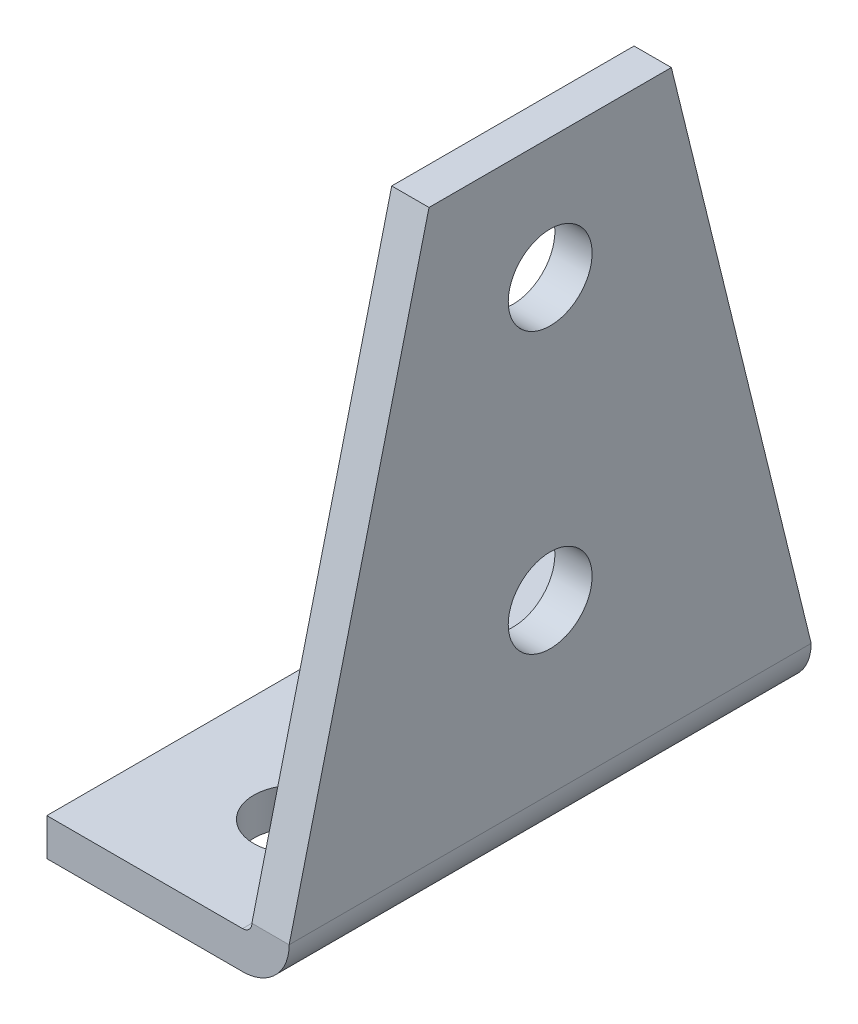
ISO-10303-21;
HEADER;
FILE_DESCRIPTION(('STEP AP214'),'2;1');
FILE_NAME('part.step','',(''),(''),'','','');
FILE_SCHEMA(('AUTOMOTIVE_DESIGN { 1 0 10303 214 1 1 1 1 }'));
ENDSEC;
DATA;
#1=APPLICATION_CONTEXT('core data for automotive mechanical design processes');
#2=APPLICATION_PROTOCOL_DEFINITION('international standard','automotive_design',2000,#1);
#3=PRODUCT_CONTEXT('',#1,'mechanical');
#4=PRODUCT('Part','Part','',(#3));
#5=PRODUCT_RELATED_PRODUCT_CATEGORY('part','',(#4));
#6=PRODUCT_DEFINITION_FORMATION('','',#4);
#7=PRODUCT_DEFINITION_CONTEXT('part definition',#1,'design');
#8=PRODUCT_DEFINITION('design','',#6,#7);
#9=PRODUCT_DEFINITION_SHAPE('','',#8);
#10=(LENGTH_UNIT() NAMED_UNIT(*) SI_UNIT(.MILLI.,.METRE.));
#11=(NAMED_UNIT(*) PLANE_ANGLE_UNIT() SI_UNIT($,.RADIAN.));
#12=(NAMED_UNIT(*) SI_UNIT($,.STERADIAN.) SOLID_ANGLE_UNIT());
#13=UNCERTAINTY_MEASURE_WITH_UNIT(LENGTH_MEASURE(1.E-05),#10,'distance_accuracy_value','');
#14=(GEOMETRIC_REPRESENTATION_CONTEXT(3) GLOBAL_UNCERTAINTY_ASSIGNED_CONTEXT((#13)) GLOBAL_UNIT_ASSIGNED_CONTEXT((#10,
#11,#12)) REPRESENTATION_CONTEXT('',''));
#15=CARTESIAN_POINT('',(0.,0.,0.));
#16=DIRECTION('',(0.,0.,1.));
#17=DIRECTION('',(1.,0.,0.));
#18=AXIS2_PLACEMENT_3D('',#15,#16,#17);
#19=CARTESIAN_POINT('',(4.44089209850063E-13,7.93749999999971,44.4500000000001));
#20=DIRECTION('',(-1.,0.,0.));
#21=DIRECTION('',(0.,0.,1.));
#22=AXIS2_PLACEMENT_3D('',#19,#20,#21);
#23=PLANE('',#22);
#24=CARTESIAN_POINT('',(0.,36.5124999999997,0.));
#25=DIRECTION('',(-1.,0.,0.));
#26=DIRECTION('',(0.,0.,1.));
#27=AXIS2_PLACEMENT_3D('',#24,#25,#26);
#28=CIRCLE('',#27,7.14375);
#29=CARTESIAN_POINT('',(0.,36.5124999999997,7.14375));
#30=VERTEX_POINT('',#29);
#31=EDGE_CURVE('E174',#30,#30,#28,.T.);
#32=ORIENTED_EDGE('',*,*,#31,.T.);
#33=EDGE_LOOP('',(#32));
#34=FACE_BOUND('',#33,.T.);
#35=CARTESIAN_POINT('',(0.,84.1374999999998,0.));
#36=DIRECTION('',(-1.,0.,0.));
#37=DIRECTION('',(0.,0.,1.));
#38=AXIS2_PLACEMENT_3D('',#35,#36,#37);
#39=CIRCLE('',#38,7.14375);
#40=CARTESIAN_POINT('',(0.,84.1374999999998,7.14375));
#41=VERTEX_POINT('',#40);
#42=EDGE_CURVE('E170',#41,#41,#39,.T.);
#43=ORIENTED_EDGE('',*,*,#42,.T.);
#44=EDGE_LOOP('',(#43));
#45=FACE_BOUND('',#44,.T.);
#46=DIRECTION('',(0.,-0.971071693103805,-0.238788121255034));
#47=VECTOR('',#46,1.);
#48=CARTESIAN_POINT('',(4.44089209850063E-13,28.5516662442982,-39.3809427268119));
#49=LINE('',#48,#47);
#50=CARTESIAN_POINT('',(0.,104.775,-20.6375000000001));
#51=VERTEX_POINT('',#50);
#52=CARTESIAN_POINT('',(0.,7.93749999999971,-44.4500000000001));
#53=VERTEX_POINT('',#52);
#54=EDGE_CURVE('E46',#51,#53,#49,.T.);
#55=ORIENTED_EDGE('',*,*,#54,.F.);
#56=DIRECTION('',(0.,0.,-1.));
#57=VECTOR('',#56,1.);
#58=CARTESIAN_POINT('',(0.,104.775,44.4500000000001));
#59=LINE('',#58,#57);
#60=CARTESIAN_POINT('',(0.,104.775,20.6375000000001));
#61=VERTEX_POINT('',#60);
#62=EDGE_CURVE('E129',#61,#51,#59,.T.);
#63=ORIENTED_EDGE('',*,*,#62,.F.);
#64=DIRECTION('',(0.,0.971071693103805,-0.238788121255034));
#65=VECTOR('',#64,1.);
#66=CARTESIAN_POINT('',(4.44089209850063E-13,7.93749999999971,44.4500000000001));
#67=LINE('',#66,#65);
#68=CARTESIAN_POINT('',(4.44089209850063E-13,7.93749999999971,44.4500000000001));
#69=VERTEX_POINT('',#68);
#70=EDGE_CURVE('E109',#69,#61,#67,.T.);
#71=ORIENTED_EDGE('',*,*,#70,.F.);
#72=DIRECTION('',(0.,0.,-1.));
#73=VECTOR('',#72,1.);
#74=CARTESIAN_POINT('',(4.44089209850063E-13,7.93749999999971,44.4500000000001));
#75=LINE('',#74,#73);
#76=EDGE_CURVE('E141',#69,#53,#75,.T.);
#77=ORIENTED_EDGE('',*,*,#76,.T.);
#78=EDGE_LOOP('',(#55,#63,#71,#77));
#79=FACE_BOUND('',#78,.T.);
#80=ADVANCED_FACE('F32',(#34,#45,#79),#23,.F.);
#81=CARTESIAN_POINT('',(-6.34999999999986,104.775,44.4500000000001));
#82=DIRECTION('',(0.,1.,0.));
#83=DIRECTION('',(0.,0.,1.));
#84=AXIS2_PLACEMENT_3D('',#81,#82,#83);
#85=PLANE('',#84);
#86=DIRECTION('',(1.,0.,0.));
#87=VECTOR('',#86,1.);
#88=CARTESIAN_POINT('',(-193.629336002158,104.775000000001,-20.6375000000001));
#89=LINE('',#88,#87);
#90=CARTESIAN_POINT('',(-6.34999999999986,104.775,-20.6375000000001));
#91=VERTEX_POINT('',#90);
#92=EDGE_CURVE('E53',#91,#51,#89,.T.);
#93=ORIENTED_EDGE('',*,*,#92,.F.);
#94=DIRECTION('',(0.,0.,-1.));
#95=VECTOR('',#94,1.);
#96=CARTESIAN_POINT('',(-6.34999999999986,104.775,44.4500000000001));
#97=LINE('',#96,#95);
#98=CARTESIAN_POINT('',(-6.34999999999986,104.775,20.6375000000001));
#99=VERTEX_POINT('',#98);
#100=EDGE_CURVE('E120',#99,#91,#97,.T.);
#101=ORIENTED_EDGE('',*,*,#100,.F.);
#102=DIRECTION('',(1.,0.,0.));
#103=VECTOR('',#102,1.);
#104=CARTESIAN_POINT('',(-193.629336002158,104.775000000001,20.6374999999999));
#105=LINE('',#104,#103);
#106=EDGE_CURVE('E167',#99,#61,#105,.T.);
#107=ORIENTED_EDGE('',*,*,#106,.T.);
#108=ORIENTED_EDGE('',*,*,#62,.T.);
#109=EDGE_LOOP('',(#93,#101,#107,#108));
#110=FACE_BOUND('',#109,.T.);
#111=ADVANCED_FACE('F226',(#110),#85,.T.);
#112=CARTESIAN_POINT('',(-6.34999999999986,7.93749999999971,44.4500000000001));
#113=DIRECTION('',(-1.,0.,0.));
#114=DIRECTION('',(0.,0.,1.));
#115=AXIS2_PLACEMENT_3D('',#112,#113,#114);
#116=PLANE('',#115);
#117=CARTESIAN_POINT('',(-6.34999999999986,36.5124999999997,0.));
#118=DIRECTION('',(-1.,0.,0.));
#119=DIRECTION('',(0.,0.,1.));
#120=AXIS2_PLACEMENT_3D('',#117,#118,#119);
#121=CIRCLE('',#120,7.14375);
#122=CARTESIAN_POINT('',(-6.34999999999986,36.5124999999997,7.14375));
#123=VERTEX_POINT('',#122);
#124=EDGE_CURVE('E177',#123,#123,#121,.T.);
#125=ORIENTED_EDGE('',*,*,#124,.F.);
#126=EDGE_LOOP('',(#125));
#127=FACE_BOUND('',#126,.T.);
#128=CARTESIAN_POINT('',(-6.34999999999986,84.1374999999998,0.));
#129=DIRECTION('',(-1.,0.,0.));
#130=DIRECTION('',(0.,0.,1.));
#131=AXIS2_PLACEMENT_3D('',#128,#129,#130);
#132=CIRCLE('',#131,7.14375);
#133=CARTESIAN_POINT('',(-6.34999999999986,84.1374999999998,7.14375));
#134=VERTEX_POINT('',#133);
#135=EDGE_CURVE('E171',#134,#134,#132,.T.);
#136=ORIENTED_EDGE('',*,*,#135,.F.);
#137=EDGE_LOOP('',(#136));
#138=FACE_BOUND('',#137,.T.);
#139=ORIENTED_EDGE('',*,*,#100,.T.);
#140=DIRECTION('',(0.,-0.971071693103805,-0.238788121255034));
#141=VECTOR('',#140,1.);
#142=CARTESIAN_POINT('',(-6.34999999999941,28.5516662442982,-39.3809427268119));
#143=LINE('',#142,#141);
#144=CARTESIAN_POINT('',(-6.3500000000003,7.93749999999971,-44.4500000000001));
#145=VERTEX_POINT('',#144);
#146=EDGE_CURVE('E124',#91,#145,#143,.T.);
#147=ORIENTED_EDGE('',*,*,#146,.T.);
#148=DIRECTION('',(0.,0.,-1.));
#149=VECTOR('',#148,1.);
#150=CARTESIAN_POINT('',(-6.34999999999986,7.93749999999971,44.4500000000001));
#151=LINE('',#150,#149);
#152=CARTESIAN_POINT('',(-6.34999999999986,7.93749999999971,44.4500000000001));
#153=VERTEX_POINT('',#152);
#154=EDGE_CURVE('E113',#153,#145,#151,.T.);
#155=ORIENTED_EDGE('',*,*,#154,.F.);
#156=DIRECTION('',(0.,0.971071693103805,-0.238788121255034));
#157=VECTOR('',#156,1.);
#158=CARTESIAN_POINT('',(-6.34999999999986,7.93749999999971,44.4500000000001));
#159=LINE('',#158,#157);
#160=EDGE_CURVE('E163',#153,#99,#159,.T.);
#161=ORIENTED_EDGE('',*,*,#160,.T.);
#162=EDGE_LOOP('',(#139,#147,#155,#161));
#163=FACE_BOUND('',#162,.T.);
#164=ADVANCED_FACE('F125',(#127,#138,#163),#116,.T.);
#165=CARTESIAN_POINT('',(-7.93749999999971,7.93749999999971,44.4500000000001));
#166=DIRECTION('',(0.,0.,1.));
#167=DIRECTION('',(1.,0.,0.));
#168=AXIS2_PLACEMENT_3D('',#165,#166,#167);
#169=PLANE('',#168);
#170=CARTESIAN_POINT('',(-7.93749999999971,7.93749999999971,44.4500000000001));
#171=DIRECTION('',(0.,0.,1.));
#172=DIRECTION('',(1.,0.,0.));
#173=AXIS2_PLACEMENT_3D('',#170,#171,#172);
#174=CIRCLE('',#173,7.9375);
#175=CARTESIAN_POINT('',(-7.93750000000015,0.,44.4500000000001));
#176=VERTEX_POINT('',#175);
#177=EDGE_CURVE('E143',#176,#69,#174,.T.);
#178=ORIENTED_EDGE('',*,*,#177,.T.);
#179=DIRECTION('',(-1.,0.,0.));
#180=VECTOR('',#179,1.);
#181=CARTESIAN_POINT('',(-7.93749999999971,7.93749999999971,44.4500000000001));
#182=LINE('',#181,#180);
#183=EDGE_CURVE('E11',#69,#153,#182,.T.);
#184=ORIENTED_EDGE('',*,*,#183,.T.);
#185=CARTESIAN_POINT('',(-7.93749999999971,7.93749999999971,44.4500000000001));
#186=DIRECTION('',(0.,0.,1.));
#187=DIRECTION('',(1.,0.,0.));
#188=AXIS2_PLACEMENT_3D('',#185,#186,#187);
#189=CIRCLE('',#188,1.5875);
#190=CARTESIAN_POINT('',(-7.93750000000015,6.3500000000003,44.4500000000001));
#191=VERTEX_POINT('',#190);
#192=EDGE_CURVE('E117',#191,#153,#189,.T.);
#193=ORIENTED_EDGE('',*,*,#192,.F.);
#194=DIRECTION('',(1.,0.,0.));
#195=VECTOR('',#194,1.);
#196=CARTESIAN_POINT('',(-41.2750000000002,6.35000000000119,44.4499999999999));
#197=LINE('',#196,#195);
#198=CARTESIAN_POINT('',(-41.2750000000002,6.35000000000119,44.4499999999999));
#199=VERTEX_POINT('',#198);
#200=EDGE_CURVE('E158',#199,#191,#197,.T.);
#201=ORIENTED_EDGE('',*,*,#200,.F.);
#202=DIRECTION('',(0.,1.,0.));
#203=VECTOR('',#202,1.);
#204=CARTESIAN_POINT('',(-41.2750000000002,1.77635683940025E-12,44.4499999999999));
#205=LINE('',#204,#203);
#206=CARTESIAN_POINT('',(-41.2750000000002,1.77635683940025E-12,44.4499999999999));
#207=VERTEX_POINT('',#206);
#208=EDGE_CURVE('E155',#207,#199,#205,.T.);
#209=ORIENTED_EDGE('',*,*,#208,.F.);
#210=DIRECTION('',(1.,0.,0.));
#211=VECTOR('',#210,1.);
#212=CARTESIAN_POINT('',(-41.2750000000002,1.77635683940025E-12,44.4499999999999));
#213=LINE('',#212,#211);
#214=EDGE_CURVE('E153',#207,#176,#213,.T.);
#215=ORIENTED_EDGE('',*,*,#214,.T.);
#216=EDGE_LOOP('',(#178,#184,#193,#201,#209,#215));
#217=FACE_BOUND('',#216,.T.);
#218=ADVANCED_FACE('F219',(#217),#169,.T.);
#219=CARTESIAN_POINT('',(-7.93750000000015,7.93749999999971,-44.4500000000001));
#220=DIRECTION('',(0.,0.,1.));
#221=DIRECTION('',(1.,0.,0.));
#222=AXIS2_PLACEMENT_3D('',#219,#220,#221);
#223=PLANE('',#222);
#224=DIRECTION('',(-1.,0.,0.));
#225=VECTOR('',#224,1.);
#226=CARTESIAN_POINT('',(-7.93750000000015,7.93749999999971,-44.4500000000001));
#227=LINE('',#226,#225);
#228=EDGE_CURVE('E39',#53,#145,#227,.T.);
#229=ORIENTED_EDGE('',*,*,#228,.F.);
#230=CARTESIAN_POINT('',(-7.93750000000015,7.93749999999971,-44.4500000000001));
#231=DIRECTION('',(0.,0.,1.));
#232=DIRECTION('',(1.,0.,0.));
#233=AXIS2_PLACEMENT_3D('',#230,#231,#232);
#234=CIRCLE('',#233,7.9375);
#235=CARTESIAN_POINT('',(-7.93750000000015,0.,-44.4500000000001));
#236=VERTEX_POINT('',#235);
#237=EDGE_CURVE('E144',#236,#53,#234,.T.);
#238=ORIENTED_EDGE('',*,*,#237,.F.);
#239=DIRECTION('',(1.,0.,0.));
#240=VECTOR('',#239,1.);
#241=CARTESIAN_POINT('',(-41.2749999999997,1.77635683940025E-12,-44.4500000000001));
#242=LINE('',#241,#240);
#243=CARTESIAN_POINT('',(-41.2749999999997,1.77635683940025E-12,-44.4500000000001));
#244=VERTEX_POINT('',#243);
#245=EDGE_CURVE('E146',#244,#236,#242,.T.);
#246=ORIENTED_EDGE('',*,*,#245,.F.);
#247=DIRECTION('',(0.,1.,0.));
#248=VECTOR('',#247,1.);
#249=CARTESIAN_POINT('',(-41.2749999999997,1.77635683940025E-12,-44.4500000000001));
#250=LINE('',#249,#248);
#251=CARTESIAN_POINT('',(-41.2750000000002,6.35000000000119,-44.4500000000001));
#252=VERTEX_POINT('',#251);
#253=EDGE_CURVE('E148',#244,#252,#250,.T.);
#254=ORIENTED_EDGE('',*,*,#253,.T.);
#255=DIRECTION('',(1.,0.,0.));
#256=VECTOR('',#255,1.);
#257=CARTESIAN_POINT('',(-41.2750000000002,6.35000000000119,-44.4500000000001));
#258=LINE('',#257,#256);
#259=CARTESIAN_POINT('',(-7.93750000000015,6.3500000000003,-44.4500000000001));
#260=VERTEX_POINT('',#259);
#261=EDGE_CURVE('E107',#252,#260,#258,.T.);
#262=ORIENTED_EDGE('',*,*,#261,.T.);
#263=CARTESIAN_POINT('',(-7.93750000000015,7.93749999999971,-44.4500000000001));
#264=DIRECTION('',(0.,0.,1.));
#265=DIRECTION('',(1.,0.,0.));
#266=AXIS2_PLACEMENT_3D('',#263,#264,#265);
#267=CIRCLE('',#266,1.5875);
#268=EDGE_CURVE('E99',#260,#145,#267,.T.);
#269=ORIENTED_EDGE('',*,*,#268,.T.);
#270=EDGE_LOOP('',(#229,#238,#246,#254,#262,#269));
#271=FACE_BOUND('',#270,.T.);
#272=ADVANCED_FACE('F101',(#271),#223,.F.);
#273=CARTESIAN_POINT('',(-7.93749999999971,7.93749999999971,44.4500000000001));
#274=DIRECTION('',(0.,0.,-1.));
#275=DIRECTION('',(-1.,0.,0.));
#276=AXIS2_PLACEMENT_3D('',#273,#274,#275);
#277=CYLINDRICAL_SURFACE('',#276,1.5875);
#278=ORIENTED_EDGE('',*,*,#268,.F.);
#279=DIRECTION('',(0.,0.,-1.));
#280=VECTOR('',#279,1.);
#281=CARTESIAN_POINT('',(-7.93750000000015,6.3500000000003,44.4500000000001));
#282=LINE('',#281,#280);
#283=EDGE_CURVE('E121',#191,#260,#282,.T.);
#284=ORIENTED_EDGE('',*,*,#283,.F.);
#285=ORIENTED_EDGE('',*,*,#192,.T.);
#286=ORIENTED_EDGE('',*,*,#154,.T.);
#287=EDGE_LOOP('',(#278,#284,#285,#286));
#288=FACE_BOUND('',#287,.T.);
#289=ADVANCED_FACE('F115',(#288),#277,.F.);
#290=CARTESIAN_POINT('',(-41.2750000000002,6.35000000000119,44.4499999999999));
#291=DIRECTION('',(0.,1.,0.));
#292=DIRECTION('',(0.,0.,1.));
#293=AXIS2_PLACEMENT_3D('',#290,#291,#292);
#294=PLANE('',#293);
#295=CARTESIAN_POINT('',(-19.5262500000002,6.3500000000003,23.8125));
#296=DIRECTION('',(0.,1.,0.));
#297=DIRECTION('',(0.,0.,1.));
#298=AXIS2_PLACEMENT_3D('',#295,#296,#297);
#299=CIRCLE('',#298,7.14375);
#300=CARTESIAN_POINT('',(-19.5262500000002,6.3500000000003,30.95625));
#301=VERTEX_POINT('',#300);
#302=EDGE_CURVE('E189',#301,#301,#299,.T.);
#303=ORIENTED_EDGE('',*,*,#302,.F.);
#304=EDGE_LOOP('',(#303));
#305=FACE_BOUND('',#304,.T.);
#306=CARTESIAN_POINT('',(-19.5262500000002,6.3500000000003,-23.8125));
#307=DIRECTION('',(0.,1.,0.));
#308=DIRECTION('',(0.,0.,1.));
#309=AXIS2_PLACEMENT_3D('',#306,#307,#308);
#310=CIRCLE('',#309,7.14375);
#311=CARTESIAN_POINT('',(-19.5262500000002,6.3500000000003,-16.66875));
#312=VERTEX_POINT('',#311);
#313=EDGE_CURVE('E183',#312,#312,#310,.T.);
#314=ORIENTED_EDGE('',*,*,#313,.F.);
#315=EDGE_LOOP('',(#314));
#316=FACE_BOUND('',#315,.T.);
#317=ORIENTED_EDGE('',*,*,#261,.F.);
#318=DIRECTION('',(0.,0.,-1.));
#319=VECTOR('',#318,1.);
#320=CARTESIAN_POINT('',(-41.2750000000002,6.35000000000119,44.4499999999999));
#321=LINE('',#320,#319);
#322=EDGE_CURVE('E134',#199,#252,#321,.T.);
#323=ORIENTED_EDGE('',*,*,#322,.F.);
#324=ORIENTED_EDGE('',*,*,#200,.T.);
#325=ORIENTED_EDGE('',*,*,#283,.T.);
#326=EDGE_LOOP('',(#317,#323,#324,#325));
#327=FACE_BOUND('',#326,.T.);
#328=ADVANCED_FACE('F205',(#305,#316,#327),#294,.T.);
#329=CARTESIAN_POINT('',(-41.2750000000002,1.77635683940025E-12,44.4499999999999));
#330=DIRECTION('',(-1.,0.,0.));
#331=DIRECTION('',(0.,0.,1.));
#332=AXIS2_PLACEMENT_3D('',#329,#330,#331);
#333=PLANE('',#332);
#334=ORIENTED_EDGE('',*,*,#253,.F.);
#335=DIRECTION('',(0.,0.,-1.));
#336=VECTOR('',#335,1.);
#337=CARTESIAN_POINT('',(-41.2750000000002,1.77635683940025E-12,44.4499999999999));
#338=LINE('',#337,#336);
#339=EDGE_CURVE('E136',#207,#244,#338,.T.);
#340=ORIENTED_EDGE('',*,*,#339,.F.);
#341=ORIENTED_EDGE('',*,*,#208,.T.);
#342=ORIENTED_EDGE('',*,*,#322,.T.);
#343=EDGE_LOOP('',(#334,#340,#341,#342));
#344=FACE_BOUND('',#343,.T.);
#345=ADVANCED_FACE('F208',(#344),#333,.T.);
#346=CARTESIAN_POINT('',(-41.2750000000002,1.77635683940025E-12,44.4499999999999));
#347=DIRECTION('',(0.,1.,0.));
#348=DIRECTION('',(0.,0.,1.));
#349=AXIS2_PLACEMENT_3D('',#346,#347,#348);
#350=PLANE('',#349);
#351=CARTESIAN_POINT('',(-19.5262500000002,0.,23.8125));
#352=DIRECTION('',(0.,1.,0.));
#353=DIRECTION('',(0.,0.,1.));
#354=AXIS2_PLACEMENT_3D('',#351,#352,#353);
#355=CIRCLE('',#354,7.14375);
#356=CARTESIAN_POINT('',(-19.5262500000002,0.,30.95625));
#357=VERTEX_POINT('',#356);
#358=EDGE_CURVE('E186',#357,#357,#355,.T.);
#359=ORIENTED_EDGE('',*,*,#358,.T.);
#360=EDGE_LOOP('',(#359));
#361=FACE_BOUND('',#360,.T.);
#362=CARTESIAN_POINT('',(-19.5262499999997,0.,-23.8125));
#363=DIRECTION('',(0.,1.,0.));
#364=DIRECTION('',(0.,0.,1.));
#365=AXIS2_PLACEMENT_3D('',#362,#363,#364);
#366=CIRCLE('',#365,7.14375);
#367=CARTESIAN_POINT('',(-19.5262499999997,0.,-16.66875));
#368=VERTEX_POINT('',#367);
#369=EDGE_CURVE('E180',#368,#368,#366,.T.);
#370=ORIENTED_EDGE('',*,*,#369,.T.);
#371=EDGE_LOOP('',(#370));
#372=FACE_BOUND('',#371,.T.);
#373=ORIENTED_EDGE('',*,*,#245,.T.);
#374=DIRECTION('',(0.,0.,-1.));
#375=VECTOR('',#374,1.);
#376=CARTESIAN_POINT('',(-7.93750000000015,0.,44.4500000000001));
#377=LINE('',#376,#375);
#378=EDGE_CURVE('E138',#176,#236,#377,.T.);
#379=ORIENTED_EDGE('',*,*,#378,.F.);
#380=ORIENTED_EDGE('',*,*,#214,.F.);
#381=ORIENTED_EDGE('',*,*,#339,.T.);
#382=EDGE_LOOP('',(#373,#379,#380,#381));
#383=FACE_BOUND('',#382,.T.);
#384=ADVANCED_FACE('F195',(#361,#372,#383),#350,.F.);
#385=CARTESIAN_POINT('',(-7.93749999999971,7.93749999999971,44.4500000000001));
#386=DIRECTION('',(0.,0.,-1.));
#387=DIRECTION('',(-1.,0.,0.));
#388=AXIS2_PLACEMENT_3D('',#385,#386,#387);
#389=CYLINDRICAL_SURFACE('',#388,7.9375);
#390=ORIENTED_EDGE('',*,*,#237,.T.);
#391=ORIENTED_EDGE('',*,*,#76,.F.);
#392=ORIENTED_EDGE('',*,*,#177,.F.);
#393=ORIENTED_EDGE('',*,*,#378,.T.);
#394=EDGE_LOOP('',(#390,#391,#392,#393));
#395=FACE_BOUND('',#394,.T.);
#396=ADVANCED_FACE('F242',(#395),#389,.T.);
#397=CARTESIAN_POINT('',(-193.629336002158,7.93750000000149,-44.4500000000001));
#398=DIRECTION('',(0.,0.238788121255034,-0.971071693103805));
#399=DIRECTION('',(0.,0.971071693103805,0.238788121255034));
#400=AXIS2_PLACEMENT_3D('',#397,#398,#399);
#401=PLANE('',#400);
#402=ORIENTED_EDGE('',*,*,#92,.T.);
#403=ORIENTED_EDGE('',*,*,#54,.T.);
#404=ORIENTED_EDGE('',*,*,#228,.T.);
#405=ORIENTED_EDGE('',*,*,#146,.F.);
#406=EDGE_LOOP('',(#402,#403,#404,#405));
#407=FACE_BOUND('',#406,.T.);
#408=ADVANCED_FACE('F128',(#407),#401,.T.);
#409=CARTESIAN_POINT('',(-193.629336002158,104.775000000001,20.6374999999999));
#410=DIRECTION('',(0.,0.238788121255034,0.971071693103805));
#411=DIRECTION('',(0.,-0.971071693103805,0.238788121255034));
#412=AXIS2_PLACEMENT_3D('',#409,#410,#411);
#413=PLANE('',#412);
#414=ORIENTED_EDGE('',*,*,#183,.F.);
#415=ORIENTED_EDGE('',*,*,#70,.T.);
#416=ORIENTED_EDGE('',*,*,#106,.F.);
#417=ORIENTED_EDGE('',*,*,#160,.F.);
#418=EDGE_LOOP('',(#414,#415,#416,#417));
#419=FACE_BOUND('',#418,.T.);
#420=ADVANCED_FACE('F225',(#419),#413,.T.);
#421=CARTESIAN_POINT('',(0.,84.1374999999998,0.));
#422=DIRECTION('',(-1.,0.,0.));
#423=DIRECTION('',(0.,0.,1.));
#424=AXIS2_PLACEMENT_3D('',#421,#422,#423);
#425=CYLINDRICAL_SURFACE('',#424,7.14375);
#426=ORIENTED_EDGE('',*,*,#42,.F.);
#427=EDGE_LOOP('',(#426));
#428=FACE_BOUND('',#427,.T.);
#429=ORIENTED_EDGE('',*,*,#135,.T.);
#430=EDGE_LOOP('',(#429));
#431=FACE_BOUND('',#430,.T.);
#432=ADVANCED_FACE('F254',(#428,#431),#425,.F.);
#433=CARTESIAN_POINT('',(0.,36.5124999999997,0.));
#434=DIRECTION('',(-1.,0.,0.));
#435=DIRECTION('',(0.,0.,1.));
#436=AXIS2_PLACEMENT_3D('',#433,#434,#435);
#437=CYLINDRICAL_SURFACE('',#436,7.14375);
#438=ORIENTED_EDGE('',*,*,#31,.F.);
#439=EDGE_LOOP('',(#438));
#440=FACE_BOUND('',#439,.T.);
#441=ORIENTED_EDGE('',*,*,#124,.T.);
#442=EDGE_LOOP('',(#441));
#443=FACE_BOUND('',#442,.T.);
#444=ADVANCED_FACE('F257',(#440,#443),#437,.F.);
#445=CARTESIAN_POINT('',(-19.5262499999997,0.,-23.8125));
#446=DIRECTION('',(0.,1.,0.));
#447=DIRECTION('',(0.,0.,1.));
#448=AXIS2_PLACEMENT_3D('',#445,#446,#447);
#449=CYLINDRICAL_SURFACE('',#448,7.14375);
#450=ORIENTED_EDGE('',*,*,#369,.F.);
#451=EDGE_LOOP('',(#450));
#452=FACE_BOUND('',#451,.T.);
#453=ORIENTED_EDGE('',*,*,#313,.T.);
#454=EDGE_LOOP('',(#453));
#455=FACE_BOUND('',#454,.T.);
#456=ADVANCED_FACE('F201',(#452,#455),#449,.F.);
#457=CARTESIAN_POINT('',(-19.5262500000002,0.,23.8125));
#458=DIRECTION('',(0.,1.,0.));
#459=DIRECTION('',(0.,0.,1.));
#460=AXIS2_PLACEMENT_3D('',#457,#458,#459);
#461=CYLINDRICAL_SURFACE('',#460,7.14375);
#462=ORIENTED_EDGE('',*,*,#358,.F.);
#463=EDGE_LOOP('',(#462));
#464=FACE_BOUND('',#463,.T.);
#465=ORIENTED_EDGE('',*,*,#302,.T.);
#466=EDGE_LOOP('',(#465));
#467=FACE_BOUND('',#466,.T.);
#468=ADVANCED_FACE('F198',(#464,#467),#461,.F.);
#469=CLOSED_SHELL('',(#80,#111,#164,#218,#272,#289,#328,#345,#384,#396,#408,#420,#432,#444,#456,#468));
#470=MANIFOLD_SOLID_BREP('B2',#469);
#471=ADVANCED_BREP_SHAPE_REPRESENTATION('',(#18,#470),#14);
#472=SHAPE_DEFINITION_REPRESENTATION(#9,#471);
ENDSEC;
END-ISO-10303-21;
